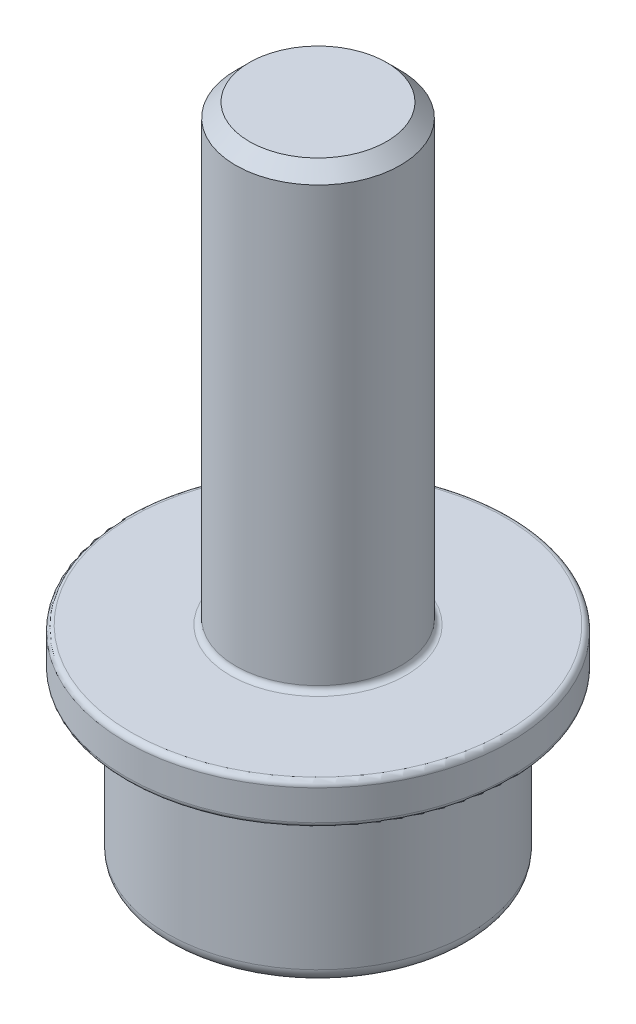
ISO-10303-21;
HEADER;
FILE_DESCRIPTION(('STEP AP214'),'2;1');
FILE_NAME('part.step','',(''),(''),'','','');
FILE_SCHEMA(('AUTOMOTIVE_DESIGN { 1 0 10303 214 1 1 1 1 }'));
ENDSEC;
DATA;
#1=APPLICATION_CONTEXT('core data for automotive mechanical design processes');
#2=APPLICATION_PROTOCOL_DEFINITION('international standard','automotive_design',2000,#1);
#3=PRODUCT_CONTEXT('',#1,'mechanical');
#4=PRODUCT('Part','Part','',(#3));
#5=PRODUCT_RELATED_PRODUCT_CATEGORY('part','',(#4));
#6=PRODUCT_DEFINITION_FORMATION('','',#4);
#7=PRODUCT_DEFINITION_CONTEXT('part definition',#1,'design');
#8=PRODUCT_DEFINITION('design','',#6,#7);
#9=PRODUCT_DEFINITION_SHAPE('','',#8);
#10=(LENGTH_UNIT() NAMED_UNIT(*) SI_UNIT(.MILLI.,.METRE.));
#11=(NAMED_UNIT(*) PLANE_ANGLE_UNIT() SI_UNIT($,.RADIAN.));
#12=(NAMED_UNIT(*) SI_UNIT($,.STERADIAN.) SOLID_ANGLE_UNIT());
#13=UNCERTAINTY_MEASURE_WITH_UNIT(LENGTH_MEASURE(1.E-05),#10,'distance_accuracy_value','');
#14=(GEOMETRIC_REPRESENTATION_CONTEXT(3) GLOBAL_UNCERTAINTY_ASSIGNED_CONTEXT((#13)) GLOBAL_UNIT_ASSIGNED_CONTEXT((#10,
#11,#12)) REPRESENTATION_CONTEXT('',''));
#15=CARTESIAN_POINT('',(0.,0.,0.));
#16=DIRECTION('',(0.,0.,1.));
#17=DIRECTION('',(1.,0.,0.));
#18=AXIS2_PLACEMENT_3D('',#15,#16,#17);
#19=CARTESIAN_POINT('',(0.,3.,0.));
#20=DIRECTION('',(0.,-1.,0.));
#21=DIRECTION('',(0.,0.,-1.));
#22=AXIS2_PLACEMENT_3D('',#19,#20,#21);
#23=CYLINDRICAL_SURFACE('',#22,2.75);
#24=CARTESIAN_POINT('',(0.,2.9,0.));
#25=DIRECTION('',(0.,1.,0.));
#26=DIRECTION('',(0.,0.,1.));
#27=AXIS2_PLACEMENT_3D('',#24,#25,#26);
#28=CIRCLE('',#27,2.75);
#29=CARTESIAN_POINT('',(0.,2.9,2.75));
#30=VERTEX_POINT('',#29);
#31=EDGE_CURVE('E201',#30,#30,#28,.F.);
#32=ORIENTED_EDGE('',*,*,#31,.T.);
#33=EDGE_LOOP('',(#32));
#34=FACE_BOUND('',#33,.T.);
#35=CARTESIAN_POINT('',(0.,0.25,0.));
#36=DIRECTION('',(0.,1.,0.));
#37=DIRECTION('',(0.,0.,1.));
#38=AXIS2_PLACEMENT_3D('',#35,#36,#37);
#39=CIRCLE('',#38,2.75);
#40=CARTESIAN_POINT('',(0.,0.25,2.75));
#41=VERTEX_POINT('',#40);
#42=EDGE_CURVE('E174',#41,#41,#39,.T.);
#43=ORIENTED_EDGE('',*,*,#42,.T.);
#44=EDGE_LOOP('',(#43));
#45=FACE_BOUND('',#44,.T.);
#46=ADVANCED_FACE('F33',(#34,#45),#23,.T.);
#47=CARTESIAN_POINT('',(0.,0.,0.));
#48=DIRECTION('',(0.,1.,0.));
#49=DIRECTION('',(0.,0.,1.));
#50=AXIS2_PLACEMENT_3D('',#47,#48,#49);
#51=PLANE('',#50);
#52=CARTESIAN_POINT('',(0.,0.,0.));
#53=DIRECTION('',(0.,1.,0.));
#54=DIRECTION('',(0.,0.,1.));
#55=AXIS2_PLACEMENT_3D('',#52,#53,#54);
#56=CIRCLE('',#55,2.5);
#57=CARTESIAN_POINT('',(0.,0.,2.5));
#58=VERTEX_POINT('',#57);
#59=EDGE_CURVE('E189',#58,#58,#56,.F.);
#60=ORIENTED_EDGE('',*,*,#59,.T.);
#61=EDGE_LOOP('',(#60));
#62=FACE_BOUND('',#61,.T.);
#63=DIRECTION('',(-0.69197693122312,0.,-0.721919612321922));
#64=VECTOR('',#63,1.);
#65=CARTESIAN_POINT('',(1.02450088015783,0.,-0.982008194523007));
#66=LINE('',#65,#64);
#67=CARTESIAN_POINT('',(1.59146357561211,0.,-0.390512335578876));
#68=VERTEX_POINT('',#67);
#69=CARTESIAN_POINT('',(0.457538184703553,0.,-1.57350405346714));
#70=VERTEX_POINT('',#69);
#71=EDGE_CURVE('E153',#68,#70,#66,.T.);
#72=ORIENTED_EDGE('',*,*,#71,.T.);
#73=DIRECTION('',(-0.971189189372558,0.,0.238309795111058));
#74=VECTOR('',#73,1.);
#75=CARTESIAN_POINT('',(-0.3381936031025,0.,-1.3782478856777));
#76=LINE('',#75,#74);
#77=CARTESIAN_POINT('',(-1.13392539090855,0.,-1.18299171788826));
#78=VERTEX_POINT('',#77);
#79=EDGE_CURVE('E163',#70,#78,#76,.T.);
#80=ORIENTED_EDGE('',*,*,#79,.T.);
#81=DIRECTION('',(-0.279212258149438,0.,0.96022940743298));
#82=VECTOR('',#81,1.);
#83=CARTESIAN_POINT('',(-1.36269448326033,0.,-0.396239691154693));
#84=LINE('',#83,#82);
#85=CARTESIAN_POINT('',(-1.5914635756121,0.,0.390512335578876));
#86=VERTEX_POINT('',#85);
#87=EDGE_CURVE('E161',#78,#86,#84,.T.);
#88=ORIENTED_EDGE('',*,*,#87,.T.);
#89=DIRECTION('',(0.69197693122312,0.,0.721919612321922));
#90=VECTOR('',#89,1.);
#91=CARTESIAN_POINT('',(-1.02450088015783,0.,0.982008194523007));
#92=LINE('',#91,#90);
#93=CARTESIAN_POINT('',(-0.457538184703552,0.,1.57350405346714));
#94=VERTEX_POINT('',#93);
#95=EDGE_CURVE('E159',#86,#94,#92,.T.);
#96=ORIENTED_EDGE('',*,*,#95,.T.);
#97=DIRECTION('',(0.971189189372558,0.,-0.238309795111058));
#98=VECTOR('',#97,1.);
#99=CARTESIAN_POINT('',(0.3381936031025,0.,1.3782478856777));
#100=LINE('',#99,#98);
#101=CARTESIAN_POINT('',(1.13392539090855,0.,1.18299171788826));
#102=VERTEX_POINT('',#101);
#103=EDGE_CURVE('E157',#94,#102,#100,.T.);
#104=ORIENTED_EDGE('',*,*,#103,.T.);
#105=DIRECTION('',(0.279212258149438,0.,-0.96022940743298));
#106=VECTOR('',#105,1.);
#107=CARTESIAN_POINT('',(1.36269448326033,0.,0.396239691154693));
#108=LINE('',#107,#106);
#109=EDGE_CURVE('E155',#102,#68,#108,.T.);
#110=ORIENTED_EDGE('',*,*,#109,.T.);
#111=EDGE_LOOP('',(#72,#80,#88,#96,#104,#110));
#112=FACE_BOUND('',#111,.T.);
#113=ADVANCED_FACE('F243',(#62,#112),#51,.F.);
#114=CARTESIAN_POINT('',(1.31110540565295,1.5,-0.321718223399928));
#115=DIRECTION('',(0.96022940743298,0.,0.279212258149438));
#116=DIRECTION('',(0.279212258149438,0.,-0.96022940743298));
#117=AXIS2_PLACEMENT_3D('',#114,#115,#116);
#118=PLANE('',#117);
#119=DIRECTION('',(0.,-1.,0.));
#120=VECTOR('',#119,1.);
#121=CARTESIAN_POINT('',(1.31110540565295,1.5,-0.321718223399928));
#122=LINE('',#121,#120);
#123=CARTESIAN_POINT('',(1.31110540565295,1.5,-0.321718223399928));
#124=VERTEX_POINT('',#123);
#125=CARTESIAN_POINT('',(1.31110540565295,0.250000000000002,-0.321718223399928));
#126=VERTEX_POINT('',#125);
#127=EDGE_CURVE('E139',#124,#126,#122,.T.);
#128=ORIENTED_EDGE('',*,*,#127,.T.);
#129=DIRECTION('',(-0.279212258149438,0.,0.96022940743298));
#130=VECTOR('',#129,1.);
#131=CARTESIAN_POINT('',(1.31110540565295,0.250000000000002,-0.321718223399928));
#132=LINE('',#131,#130);
#133=CARTESIAN_POINT('',(0.934168857151212,0.250000000000002,0.974591476634595));
#134=VERTEX_POINT('',#133);
#135=EDGE_CURVE('E55',#126,#134,#132,.T.);
#136=ORIENTED_EDGE('',*,*,#135,.T.);
#137=DIRECTION('',(0.,-1.,0.));
#138=VECTOR('',#137,1.);
#139=CARTESIAN_POINT('',(0.934168857151212,1.5,0.974591476634595));
#140=LINE('',#139,#138);
#141=CARTESIAN_POINT('',(0.934168857151212,1.5,0.974591476634595));
#142=VERTEX_POINT('',#141);
#143=EDGE_CURVE('E103',#142,#134,#140,.T.);
#144=ORIENTED_EDGE('',*,*,#143,.F.);
#145=DIRECTION('',(-0.279212258149438,0.,0.96022940743298));
#146=VECTOR('',#145,1.);
#147=CARTESIAN_POINT('',(1.31110540565295,1.5,-0.321718223399928));
#148=LINE('',#147,#146);
#149=EDGE_CURVE('E107',#124,#142,#148,.T.);
#150=ORIENTED_EDGE('',*,*,#149,.F.);
#151=EDGE_LOOP('',(#128,#136,#144,#150));
#152=FACE_BOUND('',#151,.T.);
#153=ADVANCED_FACE('F105',(#152),#118,.F.);
#154=CARTESIAN_POINT('',(0.376936548501741,1.5,-1.29630970003452));
#155=DIRECTION('',(0.721919612321922,0.,-0.69197693122312));
#156=DIRECTION('',(-0.69197693122312,0.,-0.721919612321922));
#157=AXIS2_PLACEMENT_3D('',#154,#155,#156);
#158=PLANE('',#157);
#159=DIRECTION('',(0.,-1.,0.));
#160=VECTOR('',#159,1.);
#161=CARTESIAN_POINT('',(0.376936548501741,1.5,-1.29630970003452));
#162=LINE('',#161,#160);
#163=CARTESIAN_POINT('',(0.376936548501741,1.5,-1.29630970003452));
#164=VERTEX_POINT('',#163);
#165=CARTESIAN_POINT('',(0.376936548501741,0.250000000000002,-1.29630970003452));
#166=VERTEX_POINT('',#165);
#167=EDGE_CURVE('E142',#164,#166,#162,.T.);
#168=ORIENTED_EDGE('',*,*,#167,.T.);
#169=DIRECTION('',(0.69197693122312,0.,0.721919612321922));
#170=VECTOR('',#169,1.);
#171=CARTESIAN_POINT('',(0.376936548501741,0.250000000000002,-1.29630970003452));
#172=LINE('',#171,#170);
#173=EDGE_CURVE('E48',#166,#126,#172,.T.);
#174=ORIENTED_EDGE('',*,*,#173,.T.);
#175=ORIENTED_EDGE('',*,*,#127,.F.);
#176=DIRECTION('',(0.69197693122312,0.,0.721919612321922));
#177=VECTOR('',#176,1.);
#178=CARTESIAN_POINT('',(0.376936548501741,1.5,-1.29630970003452));
#179=LINE('',#178,#177);
#180=EDGE_CURVE('E112',#164,#124,#179,.T.);
#181=ORIENTED_EDGE('',*,*,#180,.F.);
#182=EDGE_LOOP('',(#168,#174,#175,#181));
#183=FACE_BOUND('',#182,.T.);
#184=ADVANCED_FACE('F310',(#183),#158,.F.);
#185=CARTESIAN_POINT('',(-0.934168857151211,1.5,-0.974591476634595));
#186=DIRECTION('',(-0.238309795111058,0.,-0.971189189372557));
#187=DIRECTION('',(-0.971189189372558,0.,0.238309795111058));
#188=AXIS2_PLACEMENT_3D('',#185,#186,#187);
#189=PLANE('',#188);
#190=DIRECTION('',(0.,-1.,0.));
#191=VECTOR('',#190,1.);
#192=CARTESIAN_POINT('',(-0.934168857151211,1.5,-0.974591476634595));
#193=LINE('',#192,#191);
#194=CARTESIAN_POINT('',(-0.934168857151211,1.5,-0.974591476634595));
#195=VERTEX_POINT('',#194);
#196=CARTESIAN_POINT('',(-0.934168857151211,0.250000000000002,-0.974591476634595));
#197=VERTEX_POINT('',#196);
#198=EDGE_CURVE('E144',#195,#197,#193,.T.);
#199=ORIENTED_EDGE('',*,*,#198,.T.);
#200=DIRECTION('',(0.971189189372558,0.,-0.238309795111058));
#201=VECTOR('',#200,1.);
#202=CARTESIAN_POINT('',(-0.934168857151211,0.250000000000002,-0.974591476634595));
#203=LINE('',#202,#201);
#204=EDGE_CURVE('E141',#197,#166,#203,.T.);
#205=ORIENTED_EDGE('',*,*,#204,.T.);
#206=ORIENTED_EDGE('',*,*,#167,.F.);
#207=DIRECTION('',(0.971189189372558,0.,-0.238309795111058));
#208=VECTOR('',#207,1.);
#209=CARTESIAN_POINT('',(-0.934168857151211,1.5,-0.974591476634595));
#210=LINE('',#209,#208);
#211=EDGE_CURVE('E136',#195,#164,#210,.T.);
#212=ORIENTED_EDGE('',*,*,#211,.F.);
#213=EDGE_LOOP('',(#199,#205,#206,#212));
#214=FACE_BOUND('',#213,.T.);
#215=ADVANCED_FACE('F320',(#214),#189,.F.);
#216=CARTESIAN_POINT('',(-1.31110540565295,1.5,0.321718223399928));
#217=DIRECTION('',(-0.96022940743298,0.,-0.279212258149438));
#218=DIRECTION('',(-0.279212258149438,0.,0.96022940743298));
#219=AXIS2_PLACEMENT_3D('',#216,#217,#218);
#220=PLANE('',#219);
#221=DIRECTION('',(0.,-1.,0.));
#222=VECTOR('',#221,1.);
#223=CARTESIAN_POINT('',(-1.31110540565295,1.5,0.321718223399928));
#224=LINE('',#223,#222);
#225=CARTESIAN_POINT('',(-1.31110540565295,1.5,0.321718223399928));
#226=VERTEX_POINT('',#225);
#227=CARTESIAN_POINT('',(-1.31110540565295,0.250000000000002,0.321718223399928));
#228=VERTEX_POINT('',#227);
#229=EDGE_CURVE('E147',#226,#228,#224,.T.);
#230=ORIENTED_EDGE('',*,*,#229,.T.);
#231=DIRECTION('',(0.279212258149438,0.,-0.96022940743298));
#232=VECTOR('',#231,1.);
#233=CARTESIAN_POINT('',(-1.31110540565295,0.250000000000002,0.321718223399928));
#234=LINE('',#233,#232);
#235=EDGE_CURVE('E166',#228,#197,#234,.T.);
#236=ORIENTED_EDGE('',*,*,#235,.T.);
#237=ORIENTED_EDGE('',*,*,#198,.F.);
#238=DIRECTION('',(0.279212258149438,0.,-0.96022940743298));
#239=VECTOR('',#238,1.);
#240=CARTESIAN_POINT('',(-1.31110540565295,1.5,0.321718223399928));
#241=LINE('',#240,#239);
#242=EDGE_CURVE('E133',#226,#195,#241,.T.);
#243=ORIENTED_EDGE('',*,*,#242,.F.);
#244=EDGE_LOOP('',(#230,#236,#237,#243));
#245=FACE_BOUND('',#244,.T.);
#246=ADVANCED_FACE('F316',(#245),#220,.F.);
#247=CARTESIAN_POINT('',(-0.376936548501741,1.5,1.29630970003452));
#248=DIRECTION('',(-0.721919612321922,0.,0.69197693122312));
#249=DIRECTION('',(0.69197693122312,0.,0.721919612321922));
#250=AXIS2_PLACEMENT_3D('',#247,#248,#249);
#251=PLANE('',#250);
#252=DIRECTION('',(0.,-1.,0.));
#253=VECTOR('',#252,1.);
#254=CARTESIAN_POINT('',(-0.376936548501741,1.5,1.29630970003452));
#255=LINE('',#254,#253);
#256=CARTESIAN_POINT('',(-0.376936548501741,1.5,1.29630970003452));
#257=VERTEX_POINT('',#256);
#258=CARTESIAN_POINT('',(-0.376936548501741,0.250000000000002,1.29630970003452));
#259=VERTEX_POINT('',#258);
#260=EDGE_CURVE('E111',#257,#259,#255,.T.);
#261=ORIENTED_EDGE('',*,*,#260,.T.);
#262=DIRECTION('',(-0.69197693122312,0.,-0.721919612321922));
#263=VECTOR('',#262,1.);
#264=CARTESIAN_POINT('',(-0.376936548501741,0.250000000000002,1.29630970003452));
#265=LINE('',#264,#263);
#266=EDGE_CURVE('E168',#259,#228,#265,.T.);
#267=ORIENTED_EDGE('',*,*,#266,.T.);
#268=ORIENTED_EDGE('',*,*,#229,.F.);
#269=DIRECTION('',(-0.69197693122312,0.,-0.721919612321922));
#270=VECTOR('',#269,1.);
#271=CARTESIAN_POINT('',(-0.376936548501741,1.5,1.29630970003452));
#272=LINE('',#271,#270);
#273=EDGE_CURVE('E121',#257,#226,#272,.T.);
#274=ORIENTED_EDGE('',*,*,#273,.F.);
#275=EDGE_LOOP('',(#261,#267,#268,#274));
#276=FACE_BOUND('',#275,.T.);
#277=ADVANCED_FACE('F313',(#276),#251,.F.);
#278=CARTESIAN_POINT('',(0.934168857151212,1.5,0.974591476634595));
#279=DIRECTION('',(0.238309795111058,0.,0.971189189372558));
#280=DIRECTION('',(0.971189189372558,0.,-0.238309795111058));
#281=AXIS2_PLACEMENT_3D('',#278,#279,#280);
#282=PLANE('',#281);
#283=ORIENTED_EDGE('',*,*,#143,.T.);
#284=DIRECTION('',(-0.971189189372558,0.,0.238309795111058));
#285=VECTOR('',#284,1.);
#286=CARTESIAN_POINT('',(0.934168857151212,0.250000000000002,0.974591476634595));
#287=LINE('',#286,#285);
#288=EDGE_CURVE('E170',#134,#259,#287,.T.);
#289=ORIENTED_EDGE('',*,*,#288,.T.);
#290=ORIENTED_EDGE('',*,*,#260,.F.);
#291=DIRECTION('',(-0.971189189372557,0.,0.238309795111058));
#292=VECTOR('',#291,1.);
#293=CARTESIAN_POINT('',(0.934168857151212,1.5,0.974591476634595));
#294=LINE('',#293,#292);
#295=EDGE_CURVE('E115',#142,#257,#294,.T.);
#296=ORIENTED_EDGE('',*,*,#295,.F.);
#297=EDGE_LOOP('',(#283,#289,#290,#296));
#298=FACE_BOUND('',#297,.T.);
#299=ADVANCED_FACE('F116',(#298),#282,.F.);
#300=CARTESIAN_POINT('',(0.,1.5,0.));
#301=DIRECTION('',(0.,-1.,0.));
#302=DIRECTION('',(0.,0.,-1.));
#303=AXIS2_PLACEMENT_3D('',#300,#301,#302);
#304=PLANE('',#303);
#305=ORIENTED_EDGE('',*,*,#149,.T.);
#306=ORIENTED_EDGE('',*,*,#295,.T.);
#307=ORIENTED_EDGE('',*,*,#273,.T.);
#308=ORIENTED_EDGE('',*,*,#242,.T.);
#309=ORIENTED_EDGE('',*,*,#211,.T.);
#310=ORIENTED_EDGE('',*,*,#180,.T.);
#311=EDGE_LOOP('',(#305,#306,#307,#308,#309,#310));
#312=FACE_BOUND('',#311,.T.);
#313=ADVANCED_FACE('F123',(#312),#304,.T.);
#314=CARTESIAN_POINT('',(0.934168857151212,0.250000000000002,0.974591476634595));
#315=DIRECTION('',(0.168510472146206,0.707106781186547,0.686734461620402));
#316=DIRECTION('',(-0.971189189372558,0.,0.238309795111058));
#317=AXIS2_PLACEMENT_3D('',#314,#315,#316);
#318=PLANE('',#317);
#319=DIRECTION('',(-0.523085392288577,0.654653670707978,-0.545719931652561));
#320=VECTOR('',#319,1.);
#321=CARTESIAN_POINT('',(0.934168857151212,0.250000000000002,0.974591476634595));
#322=LINE('',#321,#320);
#323=EDGE_CURVE('E129',#102,#134,#322,.T.);
#324=ORIENTED_EDGE('',*,*,#323,.F.);
#325=ORIENTED_EDGE('',*,*,#103,.F.);
#326=DIRECTION('',(0.211064628018337,0.654653670707978,-0.725865203896737));
#327=VECTOR('',#326,1.);
#328=CARTESIAN_POINT('',(-0.376936548501741,0.250000000000002,1.29630970003452));
#329=LINE('',#328,#327);
#330=EDGE_CURVE('E126',#259,#94,#329,.F.);
#331=ORIENTED_EDGE('',*,*,#330,.F.);
#332=ORIENTED_EDGE('',*,*,#288,.F.);
#333=EDGE_LOOP('',(#324,#325,#331,#332));
#334=FACE_BOUND('',#333,.T.);
#335=ADVANCED_FACE('F273',(#334),#318,.F.);
#336=CARTESIAN_POINT('',(-0.376936548501741,0.250000000000002,1.29630970003452));
#337=DIRECTION('',(-0.510474253344395,0.707106781186547,0.489301580492525));
#338=DIRECTION('',(-0.69197693122312,0.,-0.721919612321922));
#339=AXIS2_PLACEMENT_3D('',#336,#337,#338);
#340=PLANE('',#339);
#341=ORIENTED_EDGE('',*,*,#330,.T.);
#342=ORIENTED_EDGE('',*,*,#95,.F.);
#343=DIRECTION('',(0.734150020306914,0.654653670707978,-0.180145272244176));
#344=VECTOR('',#343,1.);
#345=CARTESIAN_POINT('',(-1.31110540565295,0.250000000000002,0.321718223399928));
#346=LINE('',#345,#344);
#347=EDGE_CURVE('E182',#228,#86,#346,.F.);
#348=ORIENTED_EDGE('',*,*,#347,.F.);
#349=ORIENTED_EDGE('',*,*,#266,.F.);
#350=EDGE_LOOP('',(#341,#342,#348,#349));
#351=FACE_BOUND('',#350,.T.);
#352=ADVANCED_FACE('F269',(#351),#340,.F.);
#353=CARTESIAN_POINT('',(1.31110540565295,0.250000000000002,-0.321718223399928));
#354=DIRECTION('',(0.678984725490601,0.707106781186547,0.197432881127877));
#355=DIRECTION('',(-0.279212258149438,0.,0.96022940743298));
#356=AXIS2_PLACEMENT_3D('',#353,#354,#355);
#357=PLANE('',#356);
#358=ORIENTED_EDGE('',*,*,#323,.T.);
#359=ORIENTED_EDGE('',*,*,#135,.F.);
#360=DIRECTION('',(-0.734150020306914,0.654653670707978,0.180145272244176));
#361=VECTOR('',#360,1.);
#362=CARTESIAN_POINT('',(1.31110540565295,0.250000000000002,-0.321718223399928));
#363=LINE('',#362,#361);
#364=EDGE_CURVE('E179',#68,#126,#363,.T.);
#365=ORIENTED_EDGE('',*,*,#364,.F.);
#366=ORIENTED_EDGE('',*,*,#109,.F.);
#367=EDGE_LOOP('',(#358,#359,#365,#366));
#368=FACE_BOUND('',#367,.T.);
#369=ADVANCED_FACE('F265',(#368),#357,.F.);
#370=CARTESIAN_POINT('',(-1.31110540565295,0.250000000000002,0.321718223399928));
#371=DIRECTION('',(-0.678984725490601,0.707106781186547,-0.197432881127877));
#372=DIRECTION('',(0.279212258149438,0.,-0.96022940743298));
#373=AXIS2_PLACEMENT_3D('',#370,#371,#372);
#374=PLANE('',#373);
#375=ORIENTED_EDGE('',*,*,#347,.T.);
#376=ORIENTED_EDGE('',*,*,#87,.F.);
#377=DIRECTION('',(0.523085392288577,0.654653670707978,0.545719931652561));
#378=VECTOR('',#377,1.);
#379=CARTESIAN_POINT('',(-0.934168857151211,0.250000000000002,-0.974591476634595));
#380=LINE('',#379,#378);
#381=EDGE_CURVE('E177',#197,#78,#380,.F.);
#382=ORIENTED_EDGE('',*,*,#381,.F.);
#383=ORIENTED_EDGE('',*,*,#235,.F.);
#384=EDGE_LOOP('',(#375,#376,#382,#383));
#385=FACE_BOUND('',#384,.T.);
#386=ADVANCED_FACE('F261',(#385),#374,.F.);
#387=CARTESIAN_POINT('',(0.376936548501741,0.250000000000002,-1.29630970003452));
#388=DIRECTION('',(0.510474253344395,0.707106781186547,-0.489301580492525));
#389=DIRECTION('',(0.69197693122312,0.,0.721919612321922));
#390=AXIS2_PLACEMENT_3D('',#387,#388,#389);
#391=PLANE('',#390);
#392=ORIENTED_EDGE('',*,*,#364,.T.);
#393=ORIENTED_EDGE('',*,*,#173,.F.);
#394=DIRECTION('',(0.211064628018338,-0.654653670707978,-0.725865203896737));
#395=VECTOR('',#394,1.);
#396=CARTESIAN_POINT('',(0.269240391786958,0.584038370031143,-0.92593550002466));
#397=LINE('',#396,#395);
#398=EDGE_CURVE('E175',#70,#166,#397,.F.);
#399=ORIENTED_EDGE('',*,*,#398,.F.);
#400=ORIENTED_EDGE('',*,*,#71,.F.);
#401=EDGE_LOOP('',(#392,#393,#399,#400));
#402=FACE_BOUND('',#401,.T.);
#403=ADVANCED_FACE('F257',(#402),#391,.F.);
#404=CARTESIAN_POINT('',(-0.934168857151211,0.250000000000002,-0.974591476634595));
#405=DIRECTION('',(-0.168510472146206,0.707106781186547,-0.686734461620402));
#406=DIRECTION('',(0.971189189372558,0.,-0.238309795111058));
#407=AXIS2_PLACEMENT_3D('',#404,#405,#406);
#408=PLANE('',#407);
#409=ORIENTED_EDGE('',*,*,#381,.T.);
#410=ORIENTED_EDGE('',*,*,#79,.F.);
#411=ORIENTED_EDGE('',*,*,#398,.T.);
#412=ORIENTED_EDGE('',*,*,#204,.F.);
#413=EDGE_LOOP('',(#409,#410,#411,#412));
#414=FACE_BOUND('',#413,.T.);
#415=ADVANCED_FACE('F254',(#414),#408,.F.);
#416=CARTESIAN_POINT('',(0.,0.25,0.));
#417=DIRECTION('',(0.,1.,0.));
#418=DIRECTION('',(0.,0.,1.));
#419=AXIS2_PLACEMENT_3D('',#416,#417,#418);
#420=TOROIDAL_SURFACE('',#419,2.5,0.25);
#421=ORIENTED_EDGE('',*,*,#59,.F.);
#422=EDGE_LOOP('',(#421));
#423=FACE_BOUND('',#422,.T.);
#424=ORIENTED_EDGE('',*,*,#42,.F.);
#425=EDGE_LOOP('',(#424));
#426=FACE_BOUND('',#425,.T.);
#427=ADVANCED_FACE('F239',(#423,#426),#420,.T.);
#428=CARTESIAN_POINT('',(0.,2.9,0.));
#429=DIRECTION('',(0.,1.,0.));
#430=DIRECTION('',(0.,0.,1.));
#431=AXIS2_PLACEMENT_3D('',#428,#429,#430);
#432=TOROIDAL_SURFACE('',#431,2.65,0.1);
#433=ORIENTED_EDGE('',*,*,#31,.F.);
#434=EDGE_LOOP('',(#433));
#435=FACE_BOUND('',#434,.T.);
#436=CARTESIAN_POINT('',(0.,3.,0.));
#437=DIRECTION('',(0.,1.,0.));
#438=DIRECTION('',(0.,0.,1.));
#439=AXIS2_PLACEMENT_3D('',#436,#437,#438);
#440=CIRCLE('',#439,2.65);
#441=CARTESIAN_POINT('',(0.,3.,2.65));
#442=VERTEX_POINT('',#441);
#443=EDGE_CURVE('E198',#442,#442,#440,.T.);
#444=ORIENTED_EDGE('',*,*,#443,.F.);
#445=EDGE_LOOP('',(#444));
#446=FACE_BOUND('',#445,.T.);
#447=ADVANCED_FACE('F230',(#435,#446),#432,.T.);
#448=CARTESIAN_POINT('',(0.,3.75,0.));
#449=DIRECTION('',(0.,1.,0.));
#450=DIRECTION('',(0.,0.,1.));
#451=AXIS2_PLACEMENT_3D('',#448,#449,#450);
#452=PLANE('',#451);
#453=CARTESIAN_POINT('',(0.,3.75,0.));
#454=DIRECTION('',(0.,1.,0.));
#455=DIRECTION('',(0.,0.,1.));
#456=AXIS2_PLACEMENT_3D('',#453,#454,#455);
#457=CIRCLE('',#456,1.6);
#458=CARTESIAN_POINT('',(0.,3.75,1.6));
#459=VERTEX_POINT('',#458);
#460=EDGE_CURVE('E210',#459,#459,#457,.F.);
#461=ORIENTED_EDGE('',*,*,#460,.T.);
#462=EDGE_LOOP('',(#461));
#463=FACE_BOUND('',#462,.T.);
#464=CARTESIAN_POINT('',(0.,3.75,0.));
#465=DIRECTION('',(0.,1.,0.));
#466=DIRECTION('',(0.,0.,1.));
#467=AXIS2_PLACEMENT_3D('',#464,#465,#466);
#468=CIRCLE('',#467,3.4);
#469=CARTESIAN_POINT('',(0.,3.75,3.4));
#470=VERTEX_POINT('',#469);
#471=EDGE_CURVE('E207',#470,#470,#468,.T.);
#472=ORIENTED_EDGE('',*,*,#471,.T.);
#473=EDGE_LOOP('',(#472));
#474=FACE_BOUND('',#473,.T.);
#475=ADVANCED_FACE('F227',(#463,#474),#452,.T.);
#476=CARTESIAN_POINT('',(0.,3.,0.));
#477=DIRECTION('',(0.,1.,0.));
#478=DIRECTION('',(0.,0.,1.));
#479=AXIS2_PLACEMENT_3D('',#476,#477,#478);
#480=PLANE('',#479);
#481=CARTESIAN_POINT('',(0.,3.,0.));
#482=DIRECTION('',(0.,1.,0.));
#483=DIRECTION('',(0.,0.,1.));
#484=AXIS2_PLACEMENT_3D('',#481,#482,#483);
#485=CIRCLE('',#484,3.4);
#486=CARTESIAN_POINT('',(0.,3.,3.4));
#487=VERTEX_POINT('',#486);
#488=EDGE_CURVE('E11',#487,#487,#485,.F.);
#489=ORIENTED_EDGE('',*,*,#488,.T.);
#490=EDGE_LOOP('',(#489));
#491=FACE_BOUND('',#490,.T.);
#492=ORIENTED_EDGE('',*,*,#443,.T.);
#493=EDGE_LOOP('',(#492));
#494=FACE_BOUND('',#493,.T.);
#495=ADVANCED_FACE('F229',(#491,#494),#480,.F.);
#496=CARTESIAN_POINT('',(0.,3.75,0.));
#497=DIRECTION('',(0.,-1.,0.));
#498=DIRECTION('',(0.,0.,-1.));
#499=AXIS2_PLACEMENT_3D('',#496,#497,#498);
#500=CYLINDRICAL_SURFACE('',#499,3.5);
#501=CARTESIAN_POINT('',(0.,3.65,0.));
#502=DIRECTION('',(0.,1.,0.));
#503=DIRECTION('',(0.,0.,1.));
#504=AXIS2_PLACEMENT_3D('',#501,#502,#503);
#505=CIRCLE('',#504,3.5);
#506=CARTESIAN_POINT('',(0.,3.65,3.5));
#507=VERTEX_POINT('',#506);
#508=EDGE_CURVE('E41',#507,#507,#505,.F.);
#509=ORIENTED_EDGE('',*,*,#508,.T.);
#510=EDGE_LOOP('',(#509));
#511=FACE_BOUND('',#510,.T.);
#512=CARTESIAN_POINT('',(0.,3.1,0.));
#513=DIRECTION('',(0.,1.,0.));
#514=DIRECTION('',(0.,0.,1.));
#515=AXIS2_PLACEMENT_3D('',#512,#513,#514);
#516=CIRCLE('',#515,3.5);
#517=CARTESIAN_POINT('',(0.,3.1,3.5));
#518=VERTEX_POINT('',#517);
#519=EDGE_CURVE('E213',#518,#518,#516,.T.);
#520=ORIENTED_EDGE('',*,*,#519,.T.);
#521=EDGE_LOOP('',(#520));
#522=FACE_BOUND('',#521,.T.);
#523=ADVANCED_FACE('F218',(#511,#522),#500,.T.);
#524=CARTESIAN_POINT('',(0.,12.,0.));
#525=DIRECTION('',(0.,1.,0.));
#526=DIRECTION('',(0.,0.,1.));
#527=AXIS2_PLACEMENT_3D('',#524,#525,#526);
#528=PLANE('',#527);
#529=CARTESIAN_POINT('',(0.,12.,0.));
#530=DIRECTION('',(0.,1.,0.));
#531=DIRECTION('',(0.,0.,1.));
#532=AXIS2_PLACEMENT_3D('',#529,#530,#531);
#533=CIRCLE('',#532,1.25);
#534=CARTESIAN_POINT('',(0.,12.,1.25));
#535=VERTEX_POINT('',#534);
#536=EDGE_CURVE('E192',#535,#535,#533,.T.);
#537=ORIENTED_EDGE('',*,*,#536,.T.);
#538=EDGE_LOOP('',(#537));
#539=FACE_BOUND('',#538,.T.);
#540=ADVANCED_FACE('F284',(#539),#528,.T.);
#541=CARTESIAN_POINT('',(0.,12.,0.));
#542=DIRECTION('',(0.,-1.,0.));
#543=DIRECTION('',(0.,0.,-1.));
#544=AXIS2_PLACEMENT_3D('',#541,#542,#543);
#545=CONICAL_SURFACE('',#544,1.25,0.785398163397443);
#546=CARTESIAN_POINT('',(0.,11.75,0.));
#547=DIRECTION('',(0.,1.,0.));
#548=DIRECTION('',(0.,0.,1.));
#549=AXIS2_PLACEMENT_3D('',#546,#547,#548);
#550=CIRCLE('',#549,1.5);
#551=CARTESIAN_POINT('',(0.,11.75,1.5));
#552=VERTEX_POINT('',#551);
#553=EDGE_CURVE('E195',#552,#552,#550,.F.);
#554=ORIENTED_EDGE('',*,*,#553,.F.);
#555=EDGE_LOOP('',(#554));
#556=FACE_BOUND('',#555,.T.);
#557=ORIENTED_EDGE('',*,*,#536,.F.);
#558=EDGE_LOOP('',(#557));
#559=FACE_BOUND('',#558,.T.);
#560=ADVANCED_FACE('F281',(#556,#559),#545,.T.);
#561=CARTESIAN_POINT('',(0.,12.,0.));
#562=DIRECTION('',(0.,-1.,0.));
#563=DIRECTION('',(0.,0.,-1.));
#564=AXIS2_PLACEMENT_3D('',#561,#562,#563);
#565=CYLINDRICAL_SURFACE('',#564,1.5);
#566=CARTESIAN_POINT('',(0.,3.85,0.));
#567=DIRECTION('',(0.,1.,0.));
#568=DIRECTION('',(0.,0.,1.));
#569=AXIS2_PLACEMENT_3D('',#566,#567,#568);
#570=CIRCLE('',#569,1.5);
#571=CARTESIAN_POINT('',(0.,3.85,1.5));
#572=VERTEX_POINT('',#571);
#573=EDGE_CURVE('E204',#572,#572,#570,.T.);
#574=ORIENTED_EDGE('',*,*,#573,.T.);
#575=EDGE_LOOP('',(#574));
#576=FACE_BOUND('',#575,.T.);
#577=ORIENTED_EDGE('',*,*,#553,.T.);
#578=EDGE_LOOP('',(#577));
#579=FACE_BOUND('',#578,.T.);
#580=ADVANCED_FACE('F283',(#576,#579),#565,.T.);
#581=CARTESIAN_POINT('',(0.,3.85,0.));
#582=DIRECTION('',(0.,1.,0.));
#583=DIRECTION('',(0.,0.,1.));
#584=AXIS2_PLACEMENT_3D('',#581,#582,#583);
#585=TOROIDAL_SURFACE('',#584,1.6,0.1);
#586=ORIENTED_EDGE('',*,*,#460,.F.);
#587=EDGE_LOOP('',(#586));
#588=FACE_BOUND('',#587,.T.);
#589=ORIENTED_EDGE('',*,*,#573,.F.);
#590=EDGE_LOOP('',(#589));
#591=FACE_BOUND('',#590,.T.);
#592=ADVANCED_FACE('F224',(#588,#591),#585,.F.);
#593=CARTESIAN_POINT('',(0.,3.65,0.));
#594=DIRECTION('',(0.,1.,0.));
#595=DIRECTION('',(0.,0.,1.));
#596=AXIS2_PLACEMENT_3D('',#593,#594,#595);
#597=TOROIDAL_SURFACE('',#596,3.4,0.1);
#598=ORIENTED_EDGE('',*,*,#508,.F.);
#599=EDGE_LOOP('',(#598));
#600=FACE_BOUND('',#599,.T.);
#601=ORIENTED_EDGE('',*,*,#471,.F.);
#602=EDGE_LOOP('',(#601));
#603=FACE_BOUND('',#602,.T.);
#604=ADVANCED_FACE('F221',(#600,#603),#597,.T.);
#605=CARTESIAN_POINT('',(0.,3.1,0.));
#606=DIRECTION('',(0.,1.,0.));
#607=DIRECTION('',(0.,0.,1.));
#608=AXIS2_PLACEMENT_3D('',#605,#606,#607);
#609=TOROIDAL_SURFACE('',#608,3.4,0.1);
#610=ORIENTED_EDGE('',*,*,#488,.F.);
#611=EDGE_LOOP('',(#610));
#612=FACE_BOUND('',#611,.T.);
#613=ORIENTED_EDGE('',*,*,#519,.F.);
#614=EDGE_LOOP('',(#613));
#615=FACE_BOUND('',#614,.T.);
#616=ADVANCED_FACE('F35',(#612,#615),#609,.T.);
#617=CLOSED_SHELL('',(#46,#113,#153,#184,#215,#246,#277,#299,#313,#335,#352,#369,#386,#403,#415,
#427,#447,#475,#495,#523,#540,#560,#580,#592,#604,#616));
#618=MANIFOLD_SOLID_BREP('B2',#617);
#619=ADVANCED_BREP_SHAPE_REPRESENTATION('',(#18,#618),#14);
#620=SHAPE_DEFINITION_REPRESENTATION(#9,#619);
ENDSEC;
END-ISO-10303-21;
